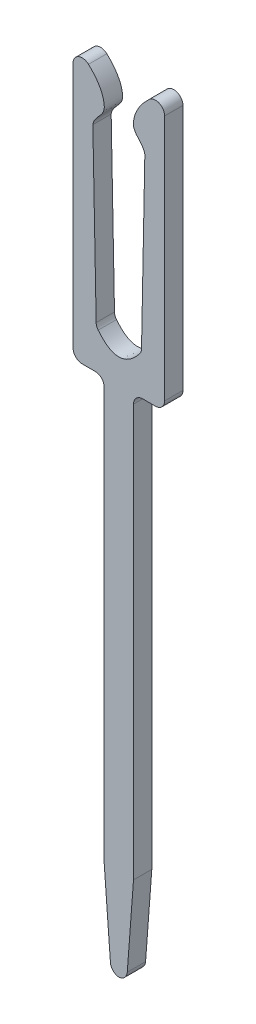
ISO-10303-21;
HEADER;
FILE_DESCRIPTION(('STEP AP214'),'2;1');
FILE_NAME('part.step','',(''),(''),'','','');
FILE_SCHEMA(('AUTOMOTIVE_DESIGN { 1 0 10303 214 1 1 1 1 }'));
ENDSEC;
DATA;
#1=APPLICATION_CONTEXT('core data for automotive mechanical design processes');
#2=APPLICATION_PROTOCOL_DEFINITION('international standard','automotive_design',2000,#1);
#3=PRODUCT_CONTEXT('',#1,'mechanical');
#4=PRODUCT('Part','Part','',(#3));
#5=PRODUCT_RELATED_PRODUCT_CATEGORY('part','',(#4));
#6=PRODUCT_DEFINITION_FORMATION('','',#4);
#7=PRODUCT_DEFINITION_CONTEXT('part definition',#1,'design');
#8=PRODUCT_DEFINITION('design','',#6,#7);
#9=PRODUCT_DEFINITION_SHAPE('','',#8);
#10=(LENGTH_UNIT() NAMED_UNIT(*) SI_UNIT(.MILLI.,.METRE.));
#11=(NAMED_UNIT(*) PLANE_ANGLE_UNIT() SI_UNIT($,.RADIAN.));
#12=(NAMED_UNIT(*) SI_UNIT($,.STERADIAN.) SOLID_ANGLE_UNIT());
#13=UNCERTAINTY_MEASURE_WITH_UNIT(LENGTH_MEASURE(1.E-05),#10,'distance_accuracy_value','');
#14=(GEOMETRIC_REPRESENTATION_CONTEXT(3) GLOBAL_UNCERTAINTY_ASSIGNED_CONTEXT((#13)) GLOBAL_UNIT_ASSIGNED_CONTEXT((#10,
#11,#12)) REPRESENTATION_CONTEXT('',''));
#15=CARTESIAN_POINT('',(0.,0.,0.));
#16=DIRECTION('',(0.,0.,1.));
#17=DIRECTION('',(1.,0.,0.));
#18=AXIS2_PLACEMENT_3D('',#15,#16,#17);
#19=CARTESIAN_POINT('',(0.0155617112013406,-9.53322485209548,-0.2));
#20=DIRECTION('',(0.,0.,1.));
#21=DIRECTION('',(1.,0.,0.));
#22=AXIS2_PLACEMENT_3D('',#19,#20,#21);
#23=CYLINDRICAL_SURFACE('',#22,0.2);
#24=CARTESIAN_POINT('',(0.0155617112013406,-9.53322485209548,0.2));
#25=DIRECTION('',(0.,0.,1.));
#26=DIRECTION('',(-1.,0.,0.));
#27=AXIS2_PLACEMENT_3D('',#24,#25,#26);
#28=CIRCLE('',#27,0.2);
#29=CARTESIAN_POINT('',(-0.183878150776374,-9.54818284174351,0.2));
#30=VERTEX_POINT('',#29);
#31=CARTESIAN_POINT('',(0.,-9.73261851584758,0.2));
#32=VERTEX_POINT('',#31);
#33=EDGE_CURVE('E222',#30,#32,#28,.T.);
#34=ORIENTED_EDGE('',*,*,#33,.F.);
#35=DIRECTION('',(0.,0.,1.));
#36=VECTOR('',#35,1.);
#37=CARTESIAN_POINT('',(-0.183878150776374,-9.54818284174351,-0.2));
#38=LINE('',#37,#36);
#39=CARTESIAN_POINT('',(-0.183878150776374,-9.54818284174351,-0.2));
#40=VERTEX_POINT('',#39);
#41=EDGE_CURVE('E11',#40,#30,#38,.T.);
#42=ORIENTED_EDGE('',*,*,#41,.F.);
#43=CARTESIAN_POINT('',(0.0155617112013406,-9.53322485209548,-0.2));
#44=DIRECTION('',(0.,0.,1.));
#45=DIRECTION('',(-1.,0.,0.));
#46=AXIS2_PLACEMENT_3D('',#43,#44,#45);
#47=CIRCLE('',#46,0.2);
#48=CARTESIAN_POINT('',(0.,-9.73261851584758,-0.2));
#49=VERTEX_POINT('',#48);
#50=EDGE_CURVE('E302',#40,#49,#47,.T.);
#51=ORIENTED_EDGE('',*,*,#50,.T.);
#52=DIRECTION('',(0.,0.,1.));
#53=VECTOR('',#52,1.);
#54=CARTESIAN_POINT('',(0.,-9.73261851584758,-0.2));
#55=LINE('',#54,#53);
#56=EDGE_CURVE('E38',#49,#32,#55,.T.);
#57=ORIENTED_EDGE('',*,*,#56,.T.);
#58=EDGE_LOOP('',(#34,#42,#51,#57));
#59=FACE_BOUND('',#58,.T.);
#60=ADVANCED_FACE('F35',(#59),#23,.T.);
#61=CARTESIAN_POINT('',(-0.183878150776374,-9.54818284174351,-0.2));
#62=DIRECTION('',(-0.997199309888568,-0.074789948240152,0.));
#63=DIRECTION('',(0.074789948240152,-0.997199309888568,0.));
#64=AXIS2_PLACEMENT_3D('',#61,#62,#63);
#65=PLANE('',#64);
#66=DIRECTION('',(0.074789948240152,-0.997199309888568,0.));
#67=VECTOR('',#66,1.);
#68=CARTESIAN_POINT('',(-0.183878150776374,-9.54818284174351,0.2));
#69=LINE('',#68,#67);
#70=CARTESIAN_POINT('',(-0.319999999997298,-7.73322485209503,0.2));
#71=VERTEX_POINT('',#70);
#72=EDGE_CURVE('E300',#71,#30,#69,.T.);
#73=ORIENTED_EDGE('',*,*,#72,.F.);
#74=DIRECTION('',(0.,0.,1.));
#75=VECTOR('',#74,1.);
#76=CARTESIAN_POINT('',(-0.319999999997298,-7.73322485209503,-0.2));
#77=LINE('',#76,#75);
#78=CARTESIAN_POINT('',(-0.319999999997298,-7.73322485209503,-0.2));
#79=VERTEX_POINT('',#78);
#80=EDGE_CURVE('E44',#79,#71,#77,.T.);
#81=ORIENTED_EDGE('',*,*,#80,.F.);
#82=DIRECTION('',(0.074789948240152,-0.997199309888568,0.));
#83=VECTOR('',#82,1.);
#84=CARTESIAN_POINT('',(-0.183878150776374,-9.54818284174351,-0.2));
#85=LINE('',#84,#83);
#86=EDGE_CURVE('E212',#79,#40,#85,.T.);
#87=ORIENTED_EDGE('',*,*,#86,.T.);
#88=ORIENTED_EDGE('',*,*,#41,.T.);
#89=EDGE_LOOP('',(#73,#81,#87,#88));
#90=FACE_BOUND('',#89,.T.);
#91=ADVANCED_FACE('F344',(#90),#65,.T.);
#92=CARTESIAN_POINT('',(-0.319999999997298,-7.73322485209503,-0.2));
#93=DIRECTION('',(-1.,0.,0.));
#94=DIRECTION('',(0.,-1.,0.));
#95=AXIS2_PLACEMENT_3D('',#92,#93,#94);
#96=PLANE('',#95);
#97=DIRECTION('',(0.,-1.,0.));
#98=VECTOR('',#97,1.);
#99=CARTESIAN_POINT('',(-0.319999999997298,-7.73322485209503,0.2));
#100=LINE('',#99,#98);
#101=CARTESIAN_POINT('',(-0.319999999997298,1.26677514790497,0.2));
#102=VERTEX_POINT('',#101);
#103=EDGE_CURVE('E199',#102,#71,#100,.T.);
#104=ORIENTED_EDGE('',*,*,#103,.F.);
#105=DIRECTION('',(0.,0.,1.));
#106=VECTOR('',#105,1.);
#107=CARTESIAN_POINT('',(-0.319999999997298,1.26677514790497,-0.2));
#108=LINE('',#107,#106);
#109=CARTESIAN_POINT('',(-0.319999999997298,1.26677514790497,-0.2));
#110=VERTEX_POINT('',#109);
#111=EDGE_CURVE('E194',#110,#102,#108,.T.);
#112=ORIENTED_EDGE('',*,*,#111,.F.);
#113=DIRECTION('',(0.,-1.,0.));
#114=VECTOR('',#113,1.);
#115=CARTESIAN_POINT('',(-0.319999999997298,-7.73322485209503,-0.2));
#116=LINE('',#115,#114);
#117=EDGE_CURVE('E197',#110,#79,#116,.T.);
#118=ORIENTED_EDGE('',*,*,#117,.T.);
#119=ORIENTED_EDGE('',*,*,#80,.T.);
#120=EDGE_LOOP('',(#104,#112,#118,#119));
#121=FACE_BOUND('',#120,.T.);
#122=ADVANCED_FACE('F196',(#121),#96,.T.);
#123=CARTESIAN_POINT('',(-0.519999999997296,1.26677514790497,-0.2));
#124=DIRECTION('',(0.,0.,1.));
#125=DIRECTION('',(1.,0.,0.));
#126=AXIS2_PLACEMENT_3D('',#123,#124,#125);
#127=CYLINDRICAL_SURFACE('',#126,0.199999999999999);
#128=CARTESIAN_POINT('',(-0.519999999997296,1.26677514790497,0.2));
#129=DIRECTION('',(0.,0.,-1.));
#130=DIRECTION('',(1.,0.,0.));
#131=AXIS2_PLACEMENT_3D('',#128,#129,#130);
#132=CIRCLE('',#131,0.199999999999999);
#133=CARTESIAN_POINT('',(-0.519999999997296,1.46677514790497,0.2));
#134=VERTEX_POINT('',#133);
#135=EDGE_CURVE('E297',#134,#102,#132,.T.);
#136=ORIENTED_EDGE('',*,*,#135,.F.);
#137=DIRECTION('',(0.,0.,1.));
#138=VECTOR('',#137,1.);
#139=CARTESIAN_POINT('',(-0.519999999997296,1.46677514790497,-0.2));
#140=LINE('',#139,#138);
#141=CARTESIAN_POINT('',(-0.519999999997296,1.46677514790497,-0.2));
#142=VERTEX_POINT('',#141);
#143=EDGE_CURVE('E204',#142,#134,#140,.T.);
#144=ORIENTED_EDGE('',*,*,#143,.F.);
#145=CARTESIAN_POINT('',(-0.519999999997296,1.26677514790497,-0.2));
#146=DIRECTION('',(0.,0.,-1.));
#147=DIRECTION('',(1.,0.,0.));
#148=AXIS2_PLACEMENT_3D('',#145,#146,#147);
#149=CIRCLE('',#148,0.199999999999999);
#150=EDGE_CURVE('E210',#142,#110,#149,.T.);
#151=ORIENTED_EDGE('',*,*,#150,.T.);
#152=ORIENTED_EDGE('',*,*,#111,.T.);
#153=EDGE_LOOP('',(#136,#144,#151,#152));
#154=FACE_BOUND('',#153,.T.);
#155=ADVANCED_FACE('F214',(#154),#127,.F.);
#156=CARTESIAN_POINT('',(-0.519999999997296,1.46677514790497,-0.2));
#157=DIRECTION('',(0.,-1.,0.));
#158=DIRECTION('',(0.,0.,-1.));
#159=AXIS2_PLACEMENT_3D('',#156,#157,#158);
#160=PLANE('',#159);
#161=DIRECTION('',(1.,0.,0.));
#162=VECTOR('',#161,1.);
#163=CARTESIAN_POINT('',(-0.519999999997296,1.46677514790497,0.2));
#164=LINE('',#163,#162);
#165=CARTESIAN_POINT('',(-0.799999999997301,1.46677514790497,0.2));
#166=VERTEX_POINT('',#165);
#167=EDGE_CURVE('E294',#166,#134,#164,.T.);
#168=ORIENTED_EDGE('',*,*,#167,.F.);
#169=DIRECTION('',(0.,0.,1.));
#170=VECTOR('',#169,1.);
#171=CARTESIAN_POINT('',(-0.799999999997301,1.46677514790497,-0.2));
#172=LINE('',#171,#170);
#173=CARTESIAN_POINT('',(-0.799999999997301,1.46677514790497,-0.2));
#174=VERTEX_POINT('',#173);
#175=EDGE_CURVE('E306',#174,#166,#172,.T.);
#176=ORIENTED_EDGE('',*,*,#175,.F.);
#177=DIRECTION('',(1.,0.,0.));
#178=VECTOR('',#177,1.);
#179=CARTESIAN_POINT('',(-0.519999999997296,1.46677514790497,-0.2));
#180=LINE('',#179,#178);
#181=EDGE_CURVE('E215',#174,#142,#180,.T.);
#182=ORIENTED_EDGE('',*,*,#181,.T.);
#183=ORIENTED_EDGE('',*,*,#143,.T.);
#184=EDGE_LOOP('',(#168,#176,#182,#183));
#185=FACE_BOUND('',#184,.T.);
#186=ADVANCED_FACE('F357',(#185),#160,.T.);
#187=CARTESIAN_POINT('',(-0.799999999997301,1.66677514790497,-0.2));
#188=DIRECTION('',(0.,0.,1.));
#189=DIRECTION('',(1.,0.,0.));
#190=AXIS2_PLACEMENT_3D('',#187,#188,#189);
#191=CYLINDRICAL_SURFACE('',#190,0.199999999999999);
#192=CARTESIAN_POINT('',(-0.799999999997301,1.66677514790497,0.2));
#193=DIRECTION('',(0.,0.,1.));
#194=DIRECTION('',(-1.,0.,0.));
#195=AXIS2_PLACEMENT_3D('',#192,#193,#194);
#196=CIRCLE('',#195,0.199999999999999);
#197=CARTESIAN_POINT('',(-0.999999999997299,1.66677514790497,0.2));
#198=VERTEX_POINT('',#197);
#199=EDGE_CURVE('E291',#198,#166,#196,.T.);
#200=ORIENTED_EDGE('',*,*,#199,.F.);
#201=DIRECTION('',(0.,0.,1.));
#202=VECTOR('',#201,1.);
#203=CARTESIAN_POINT('',(-0.999999999997299,1.66677514790497,-0.2));
#204=LINE('',#203,#202);
#205=CARTESIAN_POINT('',(-0.999999999997299,1.66677514790497,-0.2));
#206=VERTEX_POINT('',#205);
#207=EDGE_CURVE('E308',#206,#198,#204,.T.);
#208=ORIENTED_EDGE('',*,*,#207,.F.);
#209=CARTESIAN_POINT('',(-0.799999999997301,1.66677514790497,-0.2));
#210=DIRECTION('',(0.,0.,1.));
#211=DIRECTION('',(-1.,0.,0.));
#212=AXIS2_PLACEMENT_3D('',#209,#210,#211);
#213=CIRCLE('',#212,0.199999999999999);
#214=EDGE_CURVE('E217',#206,#174,#213,.T.);
#215=ORIENTED_EDGE('',*,*,#214,.T.);
#216=ORIENTED_EDGE('',*,*,#175,.T.);
#217=EDGE_LOOP('',(#200,#208,#215,#216));
#218=FACE_BOUND('',#217,.T.);
#219=ADVANCED_FACE('F360',(#218),#191,.T.);
#220=CARTESIAN_POINT('',(-0.999999999997299,1.66677514790497,-0.2));
#221=DIRECTION('',(-1.,0.,0.));
#222=DIRECTION('',(0.,0.,1.));
#223=AXIS2_PLACEMENT_3D('',#220,#221,#222);
#224=PLANE('',#223);
#225=DIRECTION('',(0.,-1.,0.));
#226=VECTOR('',#225,1.);
#227=CARTESIAN_POINT('',(-0.999999999997299,1.66677514790497,0.2));
#228=LINE('',#227,#226);
#229=CARTESIAN_POINT('',(-0.999999999997299,7.05719868487585,0.2));
#230=VERTEX_POINT('',#229);
#231=EDGE_CURVE('E288',#230,#198,#228,.T.);
#232=ORIENTED_EDGE('',*,*,#231,.F.);
#233=DIRECTION('',(0.,0.,1.));
#234=VECTOR('',#233,1.);
#235=CARTESIAN_POINT('',(-0.999999999997299,7.05719868487585,-0.2));
#236=LINE('',#235,#234);
#237=CARTESIAN_POINT('',(-0.999999999997299,7.05719868487585,-0.2));
#238=VERTEX_POINT('',#237);
#239=EDGE_CURVE('E310',#238,#230,#236,.T.);
#240=ORIENTED_EDGE('',*,*,#239,.F.);
#241=DIRECTION('',(0.,-1.,0.));
#242=VECTOR('',#241,1.);
#243=CARTESIAN_POINT('',(-0.999999999997299,1.66677514790497,-0.2));
#244=LINE('',#243,#242);
#245=EDGE_CURVE('E395',#238,#206,#244,.T.);
#246=ORIENTED_EDGE('',*,*,#245,.T.);
#247=ORIENTED_EDGE('',*,*,#207,.T.);
#248=EDGE_LOOP('',(#232,#240,#246,#247));
#249=FACE_BOUND('',#248,.T.);
#250=ADVANCED_FACE('F364',(#249),#224,.T.);
#251=CARTESIAN_POINT('',(-0.799999999997313,7.05719868487585,-0.2));
#252=DIRECTION('',(0.,0.,1.));
#253=DIRECTION('',(1.,0.,0.));
#254=AXIS2_PLACEMENT_3D('',#251,#252,#253);
#255=CYLINDRICAL_SURFACE('',#254,0.199999999999987);
#256=CARTESIAN_POINT('',(-0.799999999997313,7.05719868487585,0.2));
#257=DIRECTION('',(0.,0.,1.));
#258=DIRECTION('',(-1.,0.,0.));
#259=AXIS2_PLACEMENT_3D('',#256,#257,#258);
#260=CIRCLE('',#259,0.199999999999987);
#261=CARTESIAN_POINT('',(-0.663039519004161,7.20294444517823,0.2));
#262=VERTEX_POINT('',#261);
#263=EDGE_CURVE('E282',#262,#230,#260,.T.);
#264=ORIENTED_EDGE('',*,*,#263,.F.);
#265=DIRECTION('',(0.,0.,1.));
#266=VECTOR('',#265,1.);
#267=CARTESIAN_POINT('',(-0.663039519004161,7.20294444517823,-0.2));
#268=LINE('',#267,#266);
#269=CARTESIAN_POINT('',(-0.663039519004161,7.20294444517823,-0.2));
#270=VERTEX_POINT('',#269);
#271=EDGE_CURVE('E312',#270,#262,#268,.T.);
#272=ORIENTED_EDGE('',*,*,#271,.F.);
#273=CARTESIAN_POINT('',(-0.799999999997313,7.05719868487585,-0.2));
#274=DIRECTION('',(0.,0.,1.));
#275=DIRECTION('',(-1.,0.,0.));
#276=AXIS2_PLACEMENT_3D('',#273,#274,#275);
#277=CIRCLE('',#276,0.199999999999987);
#278=EDGE_CURVE('E387',#270,#238,#277,.T.);
#279=ORIENTED_EDGE('',*,*,#278,.T.);
#280=ORIENTED_EDGE('',*,*,#239,.T.);
#281=EDGE_LOOP('',(#264,#272,#279,#280));
#282=FACE_BOUND('',#281,.T.);
#283=ADVANCED_FACE('F368',(#282),#255,.T.);
#284=CARTESIAN_POINT('',(-0.567669207755582,6.10834496937554,-0.2));
#285=CARTESIAN_POINT('',(-0.548453887561712,6.27598469580024,-0.2));
#286=CARTESIAN_POINT('',(-0.31067113223224,6.38824738927313,-0.2));
#287=CARTESIAN_POINT('',(-0.326177603548469,6.81615503897428,-0.2));
#288=CARTESIAN_POINT('',(-0.487599251440381,7.03807938574774,-0.2));
#289=CARTESIAN_POINT('',(-0.663039519004161,7.20294444517823,-0.2));
#290=B_SPLINE_CURVE_WITH_KNOTS('',3,(#284,#285,#286,#287,#288,#289),.UNSPECIFIED.,.F.,.F.,(4,1,
1,4),(0.253308427317744,0.546240991694777,0.590136450844154,1.),.UNSPECIFIED.);
#291=DIRECTION('',(0.,0.,1.));
#292=VECTOR('',#291,1.);
#293=SURFACE_OF_LINEAR_EXTRUSION('',#290,#292);
#294=CARTESIAN_POINT('',(-0.567669207755582,6.10834496937554,0.2));
#295=CARTESIAN_POINT('',(-0.548453887561712,6.27598469580024,0.2));
#296=CARTESIAN_POINT('',(-0.31067113223224,6.38824738927313,0.2));
#297=CARTESIAN_POINT('',(-0.326177603548469,6.81615503897428,0.2));
#298=CARTESIAN_POINT('',(-0.487599251440381,7.03807938574774,0.2));
#299=CARTESIAN_POINT('',(-0.663039519004161,7.20294444517823,0.2));
#300=B_SPLINE_CURVE_WITH_KNOTS('',3,(#294,#295,#296,#297,#298,#299),.UNSPECIFIED.,.F.,.F.,(4,1,
1,4),(0.253308427317744,0.546240991694777,0.590136450844154,1.),.UNSPECIFIED.);
#301=CARTESIAN_POINT('',(-0.567669207755582,6.10834496937554,0.2));
#302=VERTEX_POINT('',#301);
#303=EDGE_CURVE('E277',#302,#262,#300,.T.);
#304=ORIENTED_EDGE('',*,*,#303,.F.);
#305=DIRECTION('',(0.,0.,1.));
#306=VECTOR('',#305,1.);
#307=CARTESIAN_POINT('',(-0.567669207755582,6.10834496937554,-0.2));
#308=LINE('',#307,#306);
#309=CARTESIAN_POINT('',(-0.567669207755582,6.10834496937554,-0.2));
#310=VERTEX_POINT('',#309);
#311=EDGE_CURVE('E314',#310,#302,#308,.T.);
#312=ORIENTED_EDGE('',*,*,#311,.F.);
#313=EDGE_CURVE('E380',#310,#270,#290,.T.);
#314=ORIENTED_EDGE('',*,*,#313,.T.);
#315=ORIENTED_EDGE('',*,*,#271,.T.);
#316=EDGE_LOOP('',(#304,#312,#314,#315));
#317=FACE_BOUND('',#316,.T.);
#318=ADVANCED_FACE('F372',(#317),#293,.T.);
#319=CARTESIAN_POINT('',(-0.567669207755582,6.10834496937554,-0.2));
#320=DIRECTION('',(0.999809016262246,0.0195430550508496,0.));
#321=DIRECTION('',(-0.0195430550508496,0.999809016262246,0.));
#322=AXIS2_PLACEMENT_3D('',#319,#320,#321);
#323=PLANE('',#322);
#324=DIRECTION('',(-0.0195430550508496,0.999809016262246,0.));
#325=VECTOR('',#324,1.);
#326=CARTESIAN_POINT('',(-0.567669207755582,6.10834496937554,0.2));
#327=LINE('',#326,#325);
#328=CARTESIAN_POINT('',(-0.495215905001466,2.40168471778945,0.2));
#329=VERTEX_POINT('',#328);
#330=EDGE_CURVE('E274',#329,#302,#327,.T.);
#331=ORIENTED_EDGE('',*,*,#330,.F.);
#332=DIRECTION('',(0.,0.,1.));
#333=VECTOR('',#332,1.);
#334=CARTESIAN_POINT('',(-0.495215905001466,2.40168471778945,-0.2));
#335=LINE('',#334,#333);
#336=CARTESIAN_POINT('',(-0.495215905001466,2.40168471778945,-0.2));
#337=VERTEX_POINT('',#336);
#338=EDGE_CURVE('E316',#337,#329,#335,.T.);
#339=ORIENTED_EDGE('',*,*,#338,.F.);
#340=DIRECTION('',(-0.0195430550508496,0.999809016262246,0.));
#341=VECTOR('',#340,1.);
#342=CARTESIAN_POINT('',(-0.567669207755582,6.10834496937554,-0.2));
#343=LINE('',#342,#341);
#344=EDGE_CURVE('E388',#337,#310,#343,.T.);
#345=ORIENTED_EDGE('',*,*,#344,.T.);
#346=ORIENTED_EDGE('',*,*,#311,.T.);
#347=EDGE_LOOP('',(#331,#339,#345,#346));
#348=FACE_BOUND('',#347,.T.);
#349=ADVANCED_FACE('F377',(#348),#323,.T.);
#350=CARTESIAN_POINT('',(-0.295254101749009,2.40559332879962,-0.2));
#351=DIRECTION('',(0.,0.,1.));
#352=DIRECTION('',(1.,0.,0.));
#353=AXIS2_PLACEMENT_3D('',#350,#351,#352);
#354=CYLINDRICAL_SURFACE('',#353,0.200000000000008);
#355=CARTESIAN_POINT('',(-0.295254101749009,2.40559332879962,0.2));
#356=DIRECTION('',(0.,0.,-1.));
#357=DIRECTION('',(1.,0.,0.));
#358=AXIS2_PLACEMENT_3D('',#355,#356,#357);
#359=CIRCLE('',#358,0.200000000000008);
#360=CARTESIAN_POINT('',(-0.451053838511068,2.28018821716187,0.2));
#361=VERTEX_POINT('',#360);
#362=EDGE_CURVE('E268',#361,#329,#359,.T.);
#363=ORIENTED_EDGE('',*,*,#362,.F.);
#364=DIRECTION('',(0.,0.,1.));
#365=VECTOR('',#364,1.);
#366=CARTESIAN_POINT('',(-0.451053838511068,2.28018821716187,-0.2));
#367=LINE('',#366,#365);
#368=CARTESIAN_POINT('',(-0.451053838511068,2.28018821716187,-0.2));
#369=VERTEX_POINT('',#368);
#370=EDGE_CURVE('E318',#369,#361,#367,.T.);
#371=ORIENTED_EDGE('',*,*,#370,.F.);
#372=CARTESIAN_POINT('',(-0.295254101749009,2.40559332879962,-0.2));
#373=DIRECTION('',(0.,0.,-1.));
#374=DIRECTION('',(1.,0.,0.));
#375=AXIS2_PLACEMENT_3D('',#372,#373,#374);
#376=CIRCLE('',#375,0.200000000000008);
#377=EDGE_CURVE('E413',#369,#337,#376,.T.);
#378=ORIENTED_EDGE('',*,*,#377,.T.);
#379=ORIENTED_EDGE('',*,*,#338,.T.);
#380=EDGE_LOOP('',(#363,#371,#378,#379));
#381=FACE_BOUND('',#380,.T.);
#382=ADVANCED_FACE('F432',(#381),#354,.F.);
#383=CARTESIAN_POINT('',(0.451053838511063,2.28018821716187,-0.2));
#384=CARTESIAN_POINT('',(0.,1.71981178283813,-0.2));
#385=CARTESIAN_POINT('',(-0.451053838511063,2.28018821716187,-0.2));
#386=B_SPLINE_CURVE_WITH_KNOTS('',2,(#383,#384,#385),.UNSPECIFIED.,.F.,.F.,(3,3),
(0.0434047342329982,0.956595265767001),.UNSPECIFIED.);
#387=DIRECTION('',(0.,0.,1.));
#388=VECTOR('',#387,1.);
#389=SURFACE_OF_LINEAR_EXTRUSION('',#386,#388);
#390=CARTESIAN_POINT('',(0.451053838511063,2.28018821716187,0.2));
#391=CARTESIAN_POINT('',(0.,1.71981178283813,0.2));
#392=CARTESIAN_POINT('',(-0.451053838511063,2.28018821716187,0.2));
#393=B_SPLINE_CURVE_WITH_KNOTS('',2,(#390,#391,#392),.UNSPECIFIED.,.F.,.F.,(3,3),
(0.0434047342329982,0.956595265767001),.UNSPECIFIED.);
#394=CARTESIAN_POINT('',(0.451053838511063,2.28018821716187,0.2));
#395=VERTEX_POINT('',#394);
#396=EDGE_CURVE('E263',#395,#361,#393,.T.);
#397=ORIENTED_EDGE('',*,*,#396,.F.);
#398=DIRECTION('',(0.,0.,1.));
#399=VECTOR('',#398,1.);
#400=CARTESIAN_POINT('',(0.451053838511063,2.28018821716187,-0.2));
#401=LINE('',#400,#399);
#402=CARTESIAN_POINT('',(0.451053838511063,2.28018821716187,-0.2));
#403=VERTEX_POINT('',#402);
#404=EDGE_CURVE('E320',#403,#395,#401,.T.);
#405=ORIENTED_EDGE('',*,*,#404,.F.);
#406=EDGE_CURVE('E414',#403,#369,#386,.T.);
#407=ORIENTED_EDGE('',*,*,#406,.T.);
#408=ORIENTED_EDGE('',*,*,#370,.T.);
#409=EDGE_LOOP('',(#397,#405,#407,#408));
#410=FACE_BOUND('',#409,.T.);
#411=ADVANCED_FACE('F428',(#410),#389,.T.);
#412=CARTESIAN_POINT('',(0.29525410174901,2.40559332879962,-0.2));
#413=DIRECTION('',(0.,0.,1.));
#414=DIRECTION('',(1.,0.,0.));
#415=AXIS2_PLACEMENT_3D('',#412,#413,#414);
#416=CYLINDRICAL_SURFACE('',#415,0.200000000000008);
#417=CARTESIAN_POINT('',(0.29525410174901,2.40559332879962,0.2));
#418=DIRECTION('',(0.,0.,-1.));
#419=DIRECTION('',(-1.,0.,0.));
#420=AXIS2_PLACEMENT_3D('',#417,#418,#419);
#421=CIRCLE('',#420,0.200000000000008);
#422=CARTESIAN_POINT('',(0.495215905001468,2.40168471778945,0.2));
#423=VERTEX_POINT('',#422);
#424=EDGE_CURVE('E260',#423,#395,#421,.T.);
#425=ORIENTED_EDGE('',*,*,#424,.F.);
#426=DIRECTION('',(0.,0.,1.));
#427=VECTOR('',#426,1.);
#428=CARTESIAN_POINT('',(0.495215905001468,2.40168471778945,-0.2));
#429=LINE('',#428,#427);
#430=CARTESIAN_POINT('',(0.495215905001468,2.40168471778945,-0.2));
#431=VERTEX_POINT('',#430);
#432=EDGE_CURVE('E322',#431,#423,#429,.T.);
#433=ORIENTED_EDGE('',*,*,#432,.F.);
#434=CARTESIAN_POINT('',(0.29525410174901,2.40559332879962,-0.2));
#435=DIRECTION('',(0.,0.,-1.));
#436=DIRECTION('',(-1.,0.,0.));
#437=AXIS2_PLACEMENT_3D('',#434,#435,#436);
#438=CIRCLE('',#437,0.200000000000008);
#439=EDGE_CURVE('E417',#431,#403,#438,.T.);
#440=ORIENTED_EDGE('',*,*,#439,.T.);
#441=ORIENTED_EDGE('',*,*,#404,.T.);
#442=EDGE_LOOP('',(#425,#433,#440,#441));
#443=FACE_BOUND('',#442,.T.);
#444=ADVANCED_FACE('F431',(#443),#416,.F.);
#445=CARTESIAN_POINT('',(0.567669207755584,6.10834496937554,-0.2));
#446=DIRECTION('',(-0.999809016262246,0.0195430550508496,0.));
#447=DIRECTION('',(-0.0195430550508496,-0.999809016262246,0.));
#448=AXIS2_PLACEMENT_3D('',#445,#446,#447);
#449=PLANE('',#448);
#450=DIRECTION('',(-0.0195430550508496,-0.999809016262246,0.));
#451=VECTOR('',#450,1.);
#452=CARTESIAN_POINT('',(0.567669207755584,6.10834496937554,0.2));
#453=LINE('',#452,#451);
#454=CARTESIAN_POINT('',(0.567669207755584,6.10834496937554,0.2));
#455=VERTEX_POINT('',#454);
#456=EDGE_CURVE('E254',#455,#423,#453,.T.);
#457=ORIENTED_EDGE('',*,*,#456,.F.);
#458=DIRECTION('',(0.,0.,1.));
#459=VECTOR('',#458,1.);
#460=CARTESIAN_POINT('',(0.567669207755584,6.10834496937554,-0.2));
#461=LINE('',#460,#459);
#462=CARTESIAN_POINT('',(0.567669207755584,6.10834496937554,-0.2));
#463=VERTEX_POINT('',#462);
#464=EDGE_CURVE('E324',#463,#455,#461,.T.);
#465=ORIENTED_EDGE('',*,*,#464,.F.);
#466=DIRECTION('',(-0.0195430550508496,-0.999809016262246,0.));
#467=VECTOR('',#466,1.);
#468=CARTESIAN_POINT('',(0.567669207755584,6.10834496937554,-0.2));
#469=LINE('',#468,#467);
#470=EDGE_CURVE('E454',#463,#431,#469,.T.);
#471=ORIENTED_EDGE('',*,*,#470,.T.);
#472=ORIENTED_EDGE('',*,*,#432,.T.);
#473=EDGE_LOOP('',(#457,#465,#471,#472));
#474=FACE_BOUND('',#473,.T.);
#475=ADVANCED_FACE('F436',(#474),#449,.T.);
#476=CARTESIAN_POINT('',(0.663039519004162,7.20294444517823,-0.2));
#477=CARTESIAN_POINT('',(0.487599251440373,7.03807938574778,-0.2));
#478=CARTESIAN_POINT('',(0.326177603548459,6.8161550389743,-0.2));
#479=CARTESIAN_POINT('',(0.310671132232229,6.38824738927312,-0.2));
#480=CARTESIAN_POINT('',(0.548453887561716,6.27598469580024,-0.2));
#481=CARTESIAN_POINT('',(0.567669207755584,6.10834496937554,-0.2));
#482=B_SPLINE_CURVE_WITH_KNOTS('',3,(#476,#477,#478,#479,#480,#481),.UNSPECIFIED.,.F.,.F.,(4,1,
1,4),(0.253308427317744,0.66317197647359,0.707067435622967,1.),.UNSPECIFIED.);
#483=DIRECTION('',(0.,0.,1.));
#484=VECTOR('',#483,1.);
#485=SURFACE_OF_LINEAR_EXTRUSION('',#482,#484);
#486=CARTESIAN_POINT('',(0.663039519004162,7.20294444517823,0.2));
#487=CARTESIAN_POINT('',(0.487599251440373,7.03807938574778,0.2));
#488=CARTESIAN_POINT('',(0.326177603548459,6.8161550389743,0.2));
#489=CARTESIAN_POINT('',(0.310671132232229,6.38824738927312,0.2));
#490=CARTESIAN_POINT('',(0.548453887561716,6.27598469580024,0.2));
#491=CARTESIAN_POINT('',(0.567669207755584,6.10834496937554,0.2));
#492=B_SPLINE_CURVE_WITH_KNOTS('',3,(#486,#487,#488,#489,#490,#491),.UNSPECIFIED.,.F.,.F.,(4,1,
1,4),(0.253308427317744,0.66317197647359,0.707067435622967,1.),.UNSPECIFIED.);
#493=CARTESIAN_POINT('',(0.663039519004162,7.20294444517823,0.2));
#494=VERTEX_POINT('',#493);
#495=EDGE_CURVE('E249',#494,#455,#492,.T.);
#496=ORIENTED_EDGE('',*,*,#495,.F.);
#497=DIRECTION('',(0.,0.,1.));
#498=VECTOR('',#497,1.);
#499=CARTESIAN_POINT('',(0.663039519004162,7.20294444517823,-0.2));
#500=LINE('',#499,#498);
#501=CARTESIAN_POINT('',(0.663039519004162,7.20294444517823,-0.2));
#502=VERTEX_POINT('',#501);
#503=EDGE_CURVE('E326',#502,#494,#500,.T.);
#504=ORIENTED_EDGE('',*,*,#503,.F.);
#505=EDGE_CURVE('E448',#502,#463,#482,.T.);
#506=ORIENTED_EDGE('',*,*,#505,.T.);
#507=ORIENTED_EDGE('',*,*,#464,.T.);
#508=EDGE_LOOP('',(#496,#504,#506,#507));
#509=FACE_BOUND('',#508,.T.);
#510=ADVANCED_FACE('F440',(#509),#485,.T.);
#511=CARTESIAN_POINT('',(0.799999999997314,7.05719868487585,-0.2));
#512=DIRECTION('',(0.,0.,1.));
#513=DIRECTION('',(1.,0.,0.));
#514=AXIS2_PLACEMENT_3D('',#511,#512,#513);
#515=CYLINDRICAL_SURFACE('',#514,0.199999999999987);
#516=CARTESIAN_POINT('',(0.799999999997314,7.05719868487585,0.2));
#517=DIRECTION('',(0.,0.,1.));
#518=DIRECTION('',(1.,0.,0.));
#519=AXIS2_PLACEMENT_3D('',#516,#517,#518);
#520=CIRCLE('',#519,0.199999999999987);
#521=CARTESIAN_POINT('',(0.999999999997301,7.05719868487585,0.2));
#522=VERTEX_POINT('',#521);
#523=EDGE_CURVE('E246',#522,#494,#520,.T.);
#524=ORIENTED_EDGE('',*,*,#523,.F.);
#525=DIRECTION('',(0.,0.,1.));
#526=VECTOR('',#525,1.);
#527=CARTESIAN_POINT('',(0.999999999997301,7.05719868487585,-0.2));
#528=LINE('',#527,#526);
#529=CARTESIAN_POINT('',(0.999999999997301,7.05719868487585,-0.2));
#530=VERTEX_POINT('',#529);
#531=EDGE_CURVE('E328',#530,#522,#528,.T.);
#532=ORIENTED_EDGE('',*,*,#531,.F.);
#533=CARTESIAN_POINT('',(0.799999999997314,7.05719868487585,-0.2));
#534=DIRECTION('',(0.,0.,1.));
#535=DIRECTION('',(1.,0.,0.));
#536=AXIS2_PLACEMENT_3D('',#533,#534,#535);
#537=CIRCLE('',#536,0.199999999999987);
#538=EDGE_CURVE('E455',#530,#502,#537,.T.);
#539=ORIENTED_EDGE('',*,*,#538,.T.);
#540=ORIENTED_EDGE('',*,*,#503,.T.);
#541=EDGE_LOOP('',(#524,#532,#539,#540));
#542=FACE_BOUND('',#541,.T.);
#543=ADVANCED_FACE('F445',(#542),#515,.T.);
#544=CARTESIAN_POINT('',(0.999999999997301,1.66677514790497,-0.2));
#545=DIRECTION('',(1.,0.,0.));
#546=DIRECTION('',(0.,0.,-1.));
#547=AXIS2_PLACEMENT_3D('',#544,#545,#546);
#548=PLANE('',#547);
#549=DIRECTION('',(0.,1.,0.));
#550=VECTOR('',#549,1.);
#551=CARTESIAN_POINT('',(0.999999999997301,1.66677514790497,0.2));
#552=LINE('',#551,#550);
#553=CARTESIAN_POINT('',(0.999999999997301,1.66677514790497,0.2));
#554=VERTEX_POINT('',#553);
#555=EDGE_CURVE('E243',#554,#522,#552,.T.);
#556=ORIENTED_EDGE('',*,*,#555,.F.);
#557=DIRECTION('',(0.,0.,1.));
#558=VECTOR('',#557,1.);
#559=CARTESIAN_POINT('',(0.999999999997301,1.66677514790497,-0.2));
#560=LINE('',#559,#558);
#561=CARTESIAN_POINT('',(0.999999999997301,1.66677514790497,-0.2));
#562=VERTEX_POINT('',#561);
#563=EDGE_CURVE('E330',#562,#554,#560,.T.);
#564=ORIENTED_EDGE('',*,*,#563,.F.);
#565=DIRECTION('',(0.,1.,0.));
#566=VECTOR('',#565,1.);
#567=CARTESIAN_POINT('',(0.999999999997301,1.66677514790497,-0.2));
#568=LINE('',#567,#566);
#569=EDGE_CURVE('E477',#562,#530,#568,.T.);
#570=ORIENTED_EDGE('',*,*,#569,.T.);
#571=ORIENTED_EDGE('',*,*,#531,.T.);
#572=EDGE_LOOP('',(#556,#564,#570,#571));
#573=FACE_BOUND('',#572,.T.);
#574=ADVANCED_FACE('F517',(#573),#548,.T.);
#575=CARTESIAN_POINT('',(0.799999999997302,1.66677514790497,-0.2));
#576=DIRECTION('',(0.,0.,1.));
#577=DIRECTION('',(1.,0.,0.));
#578=AXIS2_PLACEMENT_3D('',#575,#576,#577);
#579=CYLINDRICAL_SURFACE('',#578,0.199999999999999);
#580=CARTESIAN_POINT('',(0.799999999997302,1.66677514790497,0.2));
#581=DIRECTION('',(0.,0.,1.));
#582=DIRECTION('',(1.,0.,0.));
#583=AXIS2_PLACEMENT_3D('',#580,#581,#582);
#584=CIRCLE('',#583,0.199999999999999);
#585=CARTESIAN_POINT('',(0.799999999997302,1.46677514790497,0.2));
#586=VERTEX_POINT('',#585);
#587=EDGE_CURVE('E240',#586,#554,#584,.T.);
#588=ORIENTED_EDGE('',*,*,#587,.F.);
#589=DIRECTION('',(0.,0.,1.));
#590=VECTOR('',#589,1.);
#591=CARTESIAN_POINT('',(0.799999999997302,1.46677514790497,-0.2));
#592=LINE('',#591,#590);
#593=CARTESIAN_POINT('',(0.799999999997302,1.46677514790497,-0.2));
#594=VERTEX_POINT('',#593);
#595=EDGE_CURVE('E332',#594,#586,#592,.T.);
#596=ORIENTED_EDGE('',*,*,#595,.F.);
#597=CARTESIAN_POINT('',(0.799999999997302,1.66677514790497,-0.2));
#598=DIRECTION('',(0.,0.,1.));
#599=DIRECTION('',(1.,0.,0.));
#600=AXIS2_PLACEMENT_3D('',#597,#598,#599);
#601=CIRCLE('',#600,0.199999999999999);
#602=EDGE_CURVE('E478',#594,#562,#601,.T.);
#603=ORIENTED_EDGE('',*,*,#602,.T.);
#604=ORIENTED_EDGE('',*,*,#563,.T.);
#605=EDGE_LOOP('',(#588,#596,#603,#604));
#606=FACE_BOUND('',#605,.T.);
#607=ADVANCED_FACE('F515',(#606),#579,.T.);
#608=CARTESIAN_POINT('',(0.519999999997298,1.46677514790497,-0.2));
#609=DIRECTION('',(0.,-1.,0.));
#610=DIRECTION('',(0.,0.,-1.));
#611=AXIS2_PLACEMENT_3D('',#608,#609,#610);
#612=PLANE('',#611);
#613=DIRECTION('',(1.,0.,0.));
#614=VECTOR('',#613,1.);
#615=CARTESIAN_POINT('',(0.519999999997298,1.46677514790497,0.2));
#616=LINE('',#615,#614);
#617=CARTESIAN_POINT('',(0.519999999997298,1.46677514790497,0.2));
#618=VERTEX_POINT('',#617);
#619=EDGE_CURVE('E237',#618,#586,#616,.T.);
#620=ORIENTED_EDGE('',*,*,#619,.F.);
#621=DIRECTION('',(0.,0.,1.));
#622=VECTOR('',#621,1.);
#623=CARTESIAN_POINT('',(0.519999999997298,1.46677514790497,-0.2));
#624=LINE('',#623,#622);
#625=CARTESIAN_POINT('',(0.519999999997298,1.46677514790497,-0.2));
#626=VERTEX_POINT('',#625);
#627=EDGE_CURVE('E334',#626,#618,#624,.T.);
#628=ORIENTED_EDGE('',*,*,#627,.F.);
#629=DIRECTION('',(1.,0.,0.));
#630=VECTOR('',#629,1.);
#631=CARTESIAN_POINT('',(0.519999999997298,1.46677514790497,-0.2));
#632=LINE('',#631,#630);
#633=EDGE_CURVE('E481',#626,#594,#632,.T.);
#634=ORIENTED_EDGE('',*,*,#633,.T.);
#635=ORIENTED_EDGE('',*,*,#595,.T.);
#636=EDGE_LOOP('',(#620,#628,#634,#635));
#637=FACE_BOUND('',#636,.T.);
#638=ADVANCED_FACE('F511',(#637),#612,.T.);
#639=CARTESIAN_POINT('',(0.519999999997298,1.26677514790497,-0.2));
#640=DIRECTION('',(0.,0.,1.));
#641=DIRECTION('',(1.,0.,0.));
#642=AXIS2_PLACEMENT_3D('',#639,#640,#641);
#643=CYLINDRICAL_SURFACE('',#642,0.199999999999999);
#644=CARTESIAN_POINT('',(0.519999999997298,1.26677514790497,0.2));
#645=DIRECTION('',(0.,0.,-1.));
#646=DIRECTION('',(-1.,0.,0.));
#647=AXIS2_PLACEMENT_3D('',#644,#645,#646);
#648=CIRCLE('',#647,0.199999999999999);
#649=CARTESIAN_POINT('',(0.319999999997299,1.26677514790497,0.2));
#650=VERTEX_POINT('',#649);
#651=EDGE_CURVE('E234',#650,#618,#648,.T.);
#652=ORIENTED_EDGE('',*,*,#651,.F.);
#653=DIRECTION('',(0.,0.,1.));
#654=VECTOR('',#653,1.);
#655=CARTESIAN_POINT('',(0.319999999997299,1.26677514790497,-0.2));
#656=LINE('',#655,#654);
#657=CARTESIAN_POINT('',(0.319999999997299,1.26677514790497,-0.2));
#658=VERTEX_POINT('',#657);
#659=EDGE_CURVE('E336',#658,#650,#656,.T.);
#660=ORIENTED_EDGE('',*,*,#659,.F.);
#661=CARTESIAN_POINT('',(0.519999999997298,1.26677514790497,-0.2));
#662=DIRECTION('',(0.,0.,-1.));
#663=DIRECTION('',(-1.,0.,0.));
#664=AXIS2_PLACEMENT_3D('',#661,#662,#663);
#665=CIRCLE('',#664,0.199999999999999);
#666=EDGE_CURVE('E486',#658,#626,#665,.T.);
#667=ORIENTED_EDGE('',*,*,#666,.T.);
#668=ORIENTED_EDGE('',*,*,#627,.T.);
#669=EDGE_LOOP('',(#652,#660,#667,#668));
#670=FACE_BOUND('',#669,.T.);
#671=ADVANCED_FACE('F507',(#670),#643,.F.);
#672=CARTESIAN_POINT('',(0.3199999999973,-7.73322485209503,-0.2));
#673=DIRECTION('',(1.,0.,0.));
#674=DIRECTION('',(0.,1.,0.));
#675=AXIS2_PLACEMENT_3D('',#672,#673,#674);
#676=PLANE('',#675);
#677=DIRECTION('',(0.,1.,0.));
#678=VECTOR('',#677,1.);
#679=CARTESIAN_POINT('',(0.3199999999973,-7.73322485209503,0.2));
#680=LINE('',#679,#678);
#681=CARTESIAN_POINT('',(0.3199999999973,-7.73322485209503,0.2));
#682=VERTEX_POINT('',#681);
#683=EDGE_CURVE('E231',#682,#650,#680,.T.);
#684=ORIENTED_EDGE('',*,*,#683,.F.);
#685=DIRECTION('',(0.,0.,1.));
#686=VECTOR('',#685,1.);
#687=CARTESIAN_POINT('',(0.3199999999973,-7.73322485209503,-0.2));
#688=LINE('',#687,#686);
#689=CARTESIAN_POINT('',(0.3199999999973,-7.73322485209503,-0.2));
#690=VERTEX_POINT('',#689);
#691=EDGE_CURVE('E338',#690,#682,#688,.T.);
#692=ORIENTED_EDGE('',*,*,#691,.F.);
#693=DIRECTION('',(0.,1.,0.));
#694=VECTOR('',#693,1.);
#695=CARTESIAN_POINT('',(0.3199999999973,-7.73322485209503,-0.2));
#696=LINE('',#695,#694);
#697=EDGE_CURVE('E489',#690,#658,#696,.T.);
#698=ORIENTED_EDGE('',*,*,#697,.T.);
#699=ORIENTED_EDGE('',*,*,#659,.T.);
#700=EDGE_LOOP('',(#684,#692,#698,#699));
#701=FACE_BOUND('',#700,.T.);
#702=ADVANCED_FACE('F505',(#701),#676,.T.);
#703=CARTESIAN_POINT('',(0.183878150776377,-9.54818284174351,-0.2));
#704=DIRECTION('',(0.997199309888568,-0.0747899482401518,0.));
#705=DIRECTION('',(0.0747899482401518,0.997199309888568,0.));
#706=AXIS2_PLACEMENT_3D('',#703,#704,#705);
#707=PLANE('',#706);
#708=DIRECTION('',(0.0747899482401518,0.997199309888568,0.));
#709=VECTOR('',#708,1.);
#710=CARTESIAN_POINT('',(0.183878150776377,-9.54818284174351,0.2));
#711=LINE('',#710,#709);
#712=CARTESIAN_POINT('',(0.183878150776377,-9.54818284174351,0.2));
#713=VERTEX_POINT('',#712);
#714=EDGE_CURVE('E228',#713,#682,#711,.T.);
#715=ORIENTED_EDGE('',*,*,#714,.F.);
#716=DIRECTION('',(0.,0.,1.));
#717=VECTOR('',#716,1.);
#718=CARTESIAN_POINT('',(0.183878150776377,-9.54818284174351,-0.2));
#719=LINE('',#718,#717);
#720=CARTESIAN_POINT('',(0.183878150776377,-9.54818284174351,-0.2));
#721=VERTEX_POINT('',#720);
#722=EDGE_CURVE('E339',#721,#713,#719,.T.);
#723=ORIENTED_EDGE('',*,*,#722,.F.);
#724=DIRECTION('',(0.0747899482401518,0.997199309888568,0.));
#725=VECTOR('',#724,1.);
#726=CARTESIAN_POINT('',(0.183878150776377,-9.54818284174351,-0.2));
#727=LINE('',#726,#725);
#728=EDGE_CURVE('E492',#721,#690,#727,.T.);
#729=ORIENTED_EDGE('',*,*,#728,.T.);
#730=ORIENTED_EDGE('',*,*,#691,.T.);
#731=EDGE_LOOP('',(#715,#723,#729,#730));
#732=FACE_BOUND('',#731,.T.);
#733=ADVANCED_FACE('F501',(#732),#707,.T.);
#734=CARTESIAN_POINT('',(-0.0155617112013377,-9.53322485209548,-0.2));
#735=DIRECTION('',(0.,0.,1.));
#736=DIRECTION('',(1.,0.,0.));
#737=AXIS2_PLACEMENT_3D('',#734,#735,#736);
#738=CYLINDRICAL_SURFACE('',#737,0.2);
#739=CARTESIAN_POINT('',(-0.0155617112013377,-9.53322485209548,0.2));
#740=DIRECTION('',(0.,0.,1.));
#741=DIRECTION('',(1.,0.,0.));
#742=AXIS2_PLACEMENT_3D('',#739,#740,#741);
#743=CIRCLE('',#742,0.2);
#744=EDGE_CURVE('E225',#32,#713,#743,.T.);
#745=ORIENTED_EDGE('',*,*,#744,.F.);
#746=ORIENTED_EDGE('',*,*,#56,.F.);
#747=CARTESIAN_POINT('',(-0.0155617112013377,-9.53322485209548,-0.2));
#748=DIRECTION('',(0.,0.,1.));
#749=DIRECTION('',(1.,0.,0.));
#750=AXIS2_PLACEMENT_3D('',#747,#748,#749);
#751=CIRCLE('',#750,0.2);
#752=EDGE_CURVE('E495',#49,#721,#751,.T.);
#753=ORIENTED_EDGE('',*,*,#752,.T.);
#754=ORIENTED_EDGE('',*,*,#722,.T.);
#755=EDGE_LOOP('',(#745,#746,#753,#754));
#756=FACE_BOUND('',#755,.T.);
#757=ADVANCED_FACE('F341',(#756),#738,.T.);
#758=CARTESIAN_POINT('',(0.0155617112013406,-9.53322485209548,-0.2));
#759=DIRECTION('',(0.,0.,-1.));
#760=DIRECTION('',(-1.,0.,0.));
#761=AXIS2_PLACEMENT_3D('',#758,#759,#760);
#762=PLANE('',#761);
#763=ORIENTED_EDGE('',*,*,#50,.F.);
#764=ORIENTED_EDGE('',*,*,#86,.F.);
#765=ORIENTED_EDGE('',*,*,#117,.F.);
#766=ORIENTED_EDGE('',*,*,#150,.F.);
#767=ORIENTED_EDGE('',*,*,#181,.F.);
#768=ORIENTED_EDGE('',*,*,#214,.F.);
#769=ORIENTED_EDGE('',*,*,#245,.F.);
#770=ORIENTED_EDGE('',*,*,#278,.F.);
#771=ORIENTED_EDGE('',*,*,#313,.F.);
#772=ORIENTED_EDGE('',*,*,#344,.F.);
#773=ORIENTED_EDGE('',*,*,#377,.F.);
#774=ORIENTED_EDGE('',*,*,#406,.F.);
#775=ORIENTED_EDGE('',*,*,#439,.F.);
#776=ORIENTED_EDGE('',*,*,#470,.F.);
#777=ORIENTED_EDGE('',*,*,#505,.F.);
#778=ORIENTED_EDGE('',*,*,#538,.F.);
#779=ORIENTED_EDGE('',*,*,#569,.F.);
#780=ORIENTED_EDGE('',*,*,#602,.F.);
#781=ORIENTED_EDGE('',*,*,#633,.F.);
#782=ORIENTED_EDGE('',*,*,#666,.F.);
#783=ORIENTED_EDGE('',*,*,#697,.F.);
#784=ORIENTED_EDGE('',*,*,#728,.F.);
#785=ORIENTED_EDGE('',*,*,#752,.F.);
#786=EDGE_LOOP('',(#763,#764,#765,#766,#767,#768,#769,#770,#771,#772,#773,#774,#775,#776,#777,
#778,#779,#780,#781,#782,#783,#784,#785));
#787=FACE_BOUND('',#786,.T.);
#788=ADVANCED_FACE('F208',(#787),#762,.T.);
#789=CARTESIAN_POINT('',(0.0155617112013406,-9.53322485209548,0.2));
#790=DIRECTION('',(0.,0.,-1.));
#791=DIRECTION('',(-1.,0.,0.));
#792=AXIS2_PLACEMENT_3D('',#789,#790,#791);
#793=PLANE('',#792);
#794=ORIENTED_EDGE('',*,*,#33,.T.);
#795=ORIENTED_EDGE('',*,*,#744,.T.);
#796=ORIENTED_EDGE('',*,*,#714,.T.);
#797=ORIENTED_EDGE('',*,*,#683,.T.);
#798=ORIENTED_EDGE('',*,*,#651,.T.);
#799=ORIENTED_EDGE('',*,*,#619,.T.);
#800=ORIENTED_EDGE('',*,*,#587,.T.);
#801=ORIENTED_EDGE('',*,*,#555,.T.);
#802=ORIENTED_EDGE('',*,*,#523,.T.);
#803=ORIENTED_EDGE('',*,*,#495,.T.);
#804=ORIENTED_EDGE('',*,*,#456,.T.);
#805=ORIENTED_EDGE('',*,*,#424,.T.);
#806=ORIENTED_EDGE('',*,*,#396,.T.);
#807=ORIENTED_EDGE('',*,*,#362,.T.);
#808=ORIENTED_EDGE('',*,*,#330,.T.);
#809=ORIENTED_EDGE('',*,*,#303,.T.);
#810=ORIENTED_EDGE('',*,*,#263,.T.);
#811=ORIENTED_EDGE('',*,*,#231,.T.);
#812=ORIENTED_EDGE('',*,*,#199,.T.);
#813=ORIENTED_EDGE('',*,*,#167,.T.);
#814=ORIENTED_EDGE('',*,*,#135,.T.);
#815=ORIENTED_EDGE('',*,*,#103,.T.);
#816=ORIENTED_EDGE('',*,*,#72,.T.);
#817=EDGE_LOOP('',(#794,#795,#796,#797,#798,#799,#800,#801,#802,#803,#804,#805,#806,#807,#808,
#809,#810,#811,#812,#813,#814,#815,#816));
#818=FACE_BOUND('',#817,.T.);
#819=ADVANCED_FACE('F343',(#818),#793,.F.);
#820=CLOSED_SHELL('',(#60,#91,#122,#155,#186,#219,#250,#283,#318,#349,#382,#411,#444,#475,#510,
#543,#574,#607,#638,#671,#702,#733,#757,#788,#819));
#821=MANIFOLD_SOLID_BREP('B2',#820);
#822=ADVANCED_BREP_SHAPE_REPRESENTATION('',(#18,#821),#14);
#823=SHAPE_DEFINITION_REPRESENTATION(#9,#822);
ENDSEC;
END-ISO-10303-21;
